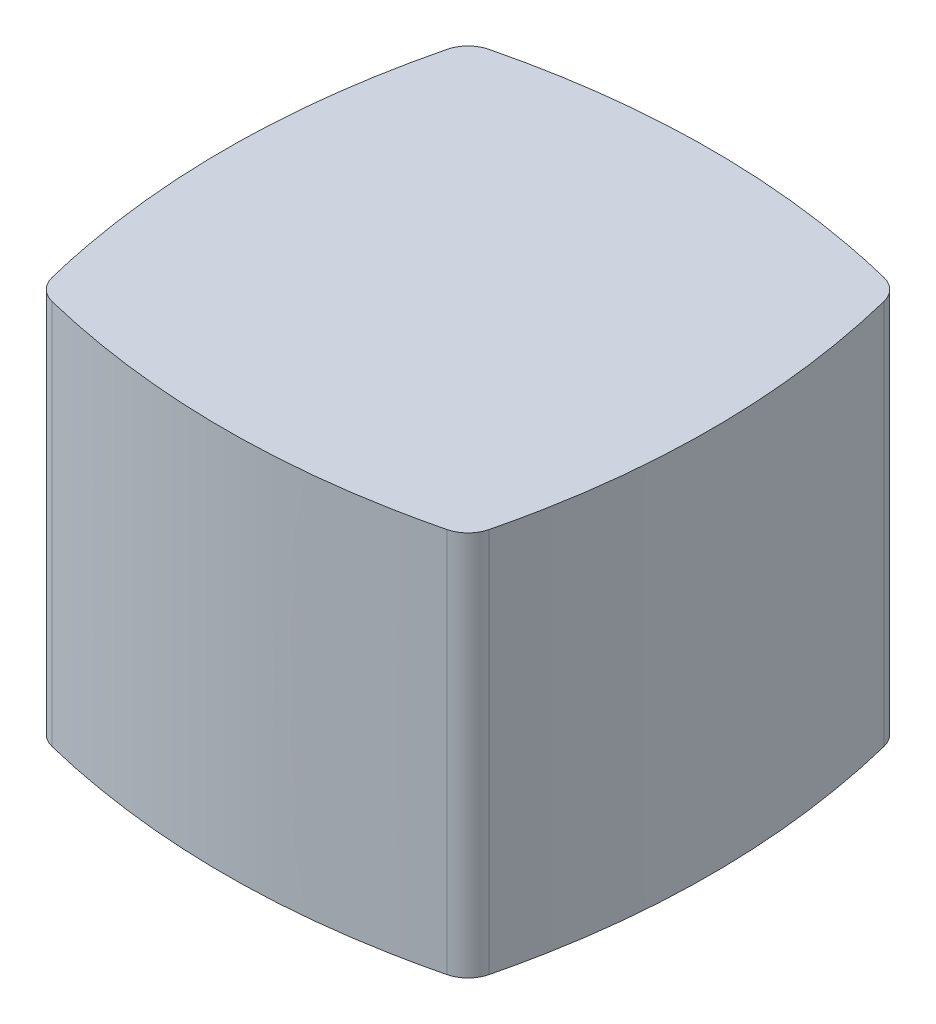
ISO-10303-21;
HEADER;
FILE_DESCRIPTION(('STEP AP214'),'2;1');
FILE_NAME('part.step','',(''),(''),'','','');
FILE_SCHEMA(('AUTOMOTIVE_DESIGN { 1 0 10303 214 1 1 1 1 }'));
ENDSEC;
DATA;
#1=APPLICATION_CONTEXT('core data for automotive mechanical design processes');
#2=APPLICATION_PROTOCOL_DEFINITION('international standard','automotive_design',2000,#1);
#3=PRODUCT_CONTEXT('',#1,'mechanical');
#4=PRODUCT('Part','Part','',(#3));
#5=PRODUCT_RELATED_PRODUCT_CATEGORY('part','',(#4));
#6=PRODUCT_DEFINITION_FORMATION('','',#4);
#7=PRODUCT_DEFINITION_CONTEXT('part definition',#1,'design');
#8=PRODUCT_DEFINITION('design','',#6,#7);
#9=PRODUCT_DEFINITION_SHAPE('','',#8);
#10=(LENGTH_UNIT() NAMED_UNIT(*) SI_UNIT(.MILLI.,.METRE.));
#11=(NAMED_UNIT(*) PLANE_ANGLE_UNIT() SI_UNIT($,.RADIAN.));
#12=(NAMED_UNIT(*) SI_UNIT($,.STERADIAN.) SOLID_ANGLE_UNIT());
#13=UNCERTAINTY_MEASURE_WITH_UNIT(LENGTH_MEASURE(1.E-05),#10,'distance_accuracy_value','');
#14=(GEOMETRIC_REPRESENTATION_CONTEXT(3) GLOBAL_UNCERTAINTY_ASSIGNED_CONTEXT((#13)) GLOBAL_UNIT_ASSIGNED_CONTEXT((#10,
#11,#12)) REPRESENTATION_CONTEXT('',''));
#15=CARTESIAN_POINT('',(0.,0.,0.));
#16=DIRECTION('',(0.,0.,1.));
#17=DIRECTION('',(1.,0.,0.));
#18=AXIS2_PLACEMENT_3D('',#15,#16,#17);
#19=CARTESIAN_POINT('',(0.,0.,0.));
#20=DIRECTION('',(0.,1.,0.));
#21=DIRECTION('',(0.,0.,1.));
#22=AXIS2_PLACEMENT_3D('',#19,#20,#21);
#23=PLANE('',#22);
#24=CARTESIAN_POINT('',(-23.8125,0.,-23.8125));
#25=CARTESIAN_POINT('',(-30.1625,0.,0.));
#26=CARTESIAN_POINT('',(-23.8125,0.,23.8125));
#27=B_SPLINE_CURVE_WITH_KNOTS('',2,(#24,#25,#26),.UNSPECIFIED.,.F.,.F.,(3,3),(0.,1.),.UNSPECIFIED.);
#28=CARTESIAN_POINT('',(-24.2868040136126,0.,-21.9619540073024));
#29=VERTEX_POINT('',#28);
#30=CARTESIAN_POINT('',(-24.2868040136126,0.,21.9619540073025));
#31=VERTEX_POINT('',#30);
#32=EDGE_CURVE('E334',#29,#31,#27,.T.);
#33=ORIENTED_EDGE('',*,*,#32,.F.);
#34=CARTESIAN_POINT('',(-21.2036810612631,0.,-21.2036810612631));
#35=DIRECTION('',(0.,1.,0.));
#36=DIRECTION('',(0.,0.,1.));
#37=AXIS2_PLACEMENT_3D('',#34,#35,#36);
#38=CIRCLE('',#37,3.175);
#39=CARTESIAN_POINT('',(-21.9619540073024,0.,-24.2868040136126));
#40=VERTEX_POINT('',#39);
#41=EDGE_CURVE('E363',#29,#40,#38,.F.);
#42=ORIENTED_EDGE('',*,*,#41,.T.);
#43=CARTESIAN_POINT('',(-23.8125,0.,-23.8125));
#44=CARTESIAN_POINT('',(0.,0.,-30.1625));
#45=CARTESIAN_POINT('',(23.8125,0.,-23.8125));
#46=B_SPLINE_CURVE_WITH_KNOTS('',2,(#43,#44,#45),.UNSPECIFIED.,.F.,.F.,(3,3),(0.,1.),.UNSPECIFIED.);
#47=CARTESIAN_POINT('',(21.9619540073025,0.,-24.2868040136126));
#48=VERTEX_POINT('',#47);
#49=EDGE_CURVE('E326',#40,#48,#46,.T.);
#50=ORIENTED_EDGE('',*,*,#49,.T.);
#51=CARTESIAN_POINT('',(21.2036810612631,0.,-21.2036810612631));
#52=DIRECTION('',(0.,1.,0.));
#53=DIRECTION('',(0.,0.,1.));
#54=AXIS2_PLACEMENT_3D('',#51,#52,#53);
#55=CIRCLE('',#54,3.175);
#56=CARTESIAN_POINT('',(24.2868040136126,0.,-21.9619540073024));
#57=VERTEX_POINT('',#56);
#58=EDGE_CURVE('E361',#48,#57,#55,.F.);
#59=ORIENTED_EDGE('',*,*,#58,.T.);
#60=CARTESIAN_POINT('',(23.8125,0.,-23.8125));
#61=CARTESIAN_POINT('',(30.1625,0.,0.));
#62=CARTESIAN_POINT('',(23.8125,0.,23.8125));
#63=B_SPLINE_CURVE_WITH_KNOTS('',2,(#60,#61,#62),.UNSPECIFIED.,.F.,.F.,(3,3),(0.,1.),.UNSPECIFIED.);
#64=CARTESIAN_POINT('',(24.2868040136126,0.,21.9619540073024));
#65=VERTEX_POINT('',#64);
#66=EDGE_CURVE('E197',#57,#65,#63,.T.);
#67=ORIENTED_EDGE('',*,*,#66,.T.);
#68=CARTESIAN_POINT('',(21.2036810612631,0.,21.2036810612631));
#69=DIRECTION('',(0.,1.,0.));
#70=DIRECTION('',(0.,0.,1.));
#71=AXIS2_PLACEMENT_3D('',#68,#69,#70);
#72=CIRCLE('',#71,3.175);
#73=CARTESIAN_POINT('',(21.9619540073024,0.,24.2868040136126));
#74=VERTEX_POINT('',#73);
#75=EDGE_CURVE('E357',#65,#74,#72,.F.);
#76=ORIENTED_EDGE('',*,*,#75,.T.);
#77=CARTESIAN_POINT('',(-23.8125,0.,23.8125));
#78=CARTESIAN_POINT('',(0.,0.,30.1625));
#79=CARTESIAN_POINT('',(23.8125,0.,23.8125));
#80=B_SPLINE_CURVE_WITH_KNOTS('',2,(#77,#78,#79),.UNSPECIFIED.,.F.,.F.,(3,3),(0.,1.),.UNSPECIFIED.);
#81=CARTESIAN_POINT('',(-21.9619540073024,0.,24.2868040136126));
#82=VERTEX_POINT('',#81);
#83=EDGE_CURVE('E342',#82,#74,#80,.T.);
#84=ORIENTED_EDGE('',*,*,#83,.F.);
#85=CARTESIAN_POINT('',(-21.2036810612631,0.,21.2036810612631));
#86=DIRECTION('',(0.,1.,0.));
#87=DIRECTION('',(0.,0.,1.));
#88=AXIS2_PLACEMENT_3D('',#85,#86,#87);
#89=CIRCLE('',#88,3.175);
#90=EDGE_CURVE('E359',#82,#31,#89,.F.);
#91=ORIENTED_EDGE('',*,*,#90,.T.);
#92=EDGE_LOOP('',(#33,#42,#50,#59,#67,#76,#84,#91));
#93=FACE_BOUND('',#92,.T.);
#94=CARTESIAN_POINT('',(-21.2036810612631,0.,-21.2036810612631));
#95=DIRECTION('',(0.,1.,0.));
#96=DIRECTION('',(0.,0.,1.));
#97=AXIS2_PLACEMENT_3D('',#94,#95,#96);
#98=CIRCLE('',#97,0.635);
#99=CARTESIAN_POINT('',(-21.820305651733,0.,-21.3553356504709));
#100=VERTEX_POINT('',#99);
#101=CARTESIAN_POINT('',(-21.3553356504708,0.,-21.820305651733));
#102=VERTEX_POINT('',#101);
#103=EDGE_CURVE('E188',#100,#102,#98,.F.);
#104=ORIENTED_EDGE('',*,*,#103,.F.);
#105=CARTESIAN_POINT('',(-21.820305651733,0.,-21.3553356504709));
#106=CARTESIAN_POINT('',(-21.9889937306754,0.,-20.6694737113603));
#107=CARTESIAN_POINT('',(-22.1500235066238,0.,-19.9817220928799));
#108=CARTESIAN_POINT('',(-22.456461114876,0.,-18.6027041737678));
#109=CARTESIAN_POINT('',(-22.601867992438,0.,-17.9114376610356));
#110=CARTESIAN_POINT('',(-22.8767359303733,0.,-16.5257276620229));
#111=CARTESIAN_POINT('',(-23.006196741606,0.,-15.8312841262805));
#112=CARTESIAN_POINT('',(-23.2488705156842,0.,-14.4396617999715));
#113=CARTESIAN_POINT('',(-23.3620857172163,0.,-13.7424833999051));
#114=CARTESIAN_POINT('',(-23.5720328451578,0.,-12.3456569201668));
#115=CARTESIAN_POINT('',(-23.6687650368139,0.,-11.6460088804216));
#116=CARTESIAN_POINT('',(-23.8455257692146,0.,-10.2446151461379));
#117=CARTESIAN_POINT('',(-23.9255543645245,0.,-9.54286945845949));
#118=CARTESIAN_POINT('',(-24.1045482393076,0.,-7.78596326287623));
#119=CARTESIAN_POINT('',(-24.1929441074628,0.,-6.72970632794476));
#120=CARTESIAN_POINT('',(-24.3312168757869,0.,-4.61469115724582));
#121=CARTESIAN_POINT('',(-24.3810938939382,0.,-3.55593292914972));
#122=CARTESIAN_POINT('',(-24.4420640778126,0.,-1.43719339677564));
#123=CARTESIAN_POINT('',(-24.4531535174817,0.,-0.377211984778237));
#124=CARTESIAN_POINT('',(-24.4364752606939,0.,1.74248211430688));
#125=CARTESIAN_POINT('',(-24.4087062893066,0.,2.80219479143653));
#126=CARTESIAN_POINT('',(-24.3178750791838,0.,4.84323455009302));
#127=CARTESIAN_POINT('',(-24.2575131212389,0.,5.82468296286204));
#128=CARTESIAN_POINT('',(-24.1037610083231,0.,7.78508809390278));
#129=CARTESIAN_POINT('',(-24.010367562777,0.,8.76404455413815));
#130=CARTESIAN_POINT('',(-23.7909731987534,0.,10.7183737832632));
#131=CARTESIAN_POINT('',(-23.664969570247,0.,11.6937462474737));
#132=CARTESIAN_POINT('',(-23.3807932293291,0.,13.6407203759649));
#133=CARTESIAN_POINT('',(-23.2225905650193,0.,14.6123176646625));
#134=CARTESIAN_POINT('',(-22.8747878301993,0.,16.5497915572413));
#135=CARTESIAN_POINT('',(-22.6851901183949,0.,17.5156685852428));
#136=CARTESIAN_POINT('',(-22.2754519085035,0.,19.4407019994944));
#137=CARTESIAN_POINT('',(-22.0553181895215,0.,20.3998598279187));
#138=CARTESIAN_POINT('',(-21.820305651733,0.,21.3553356504708));
#139=B_SPLINE_CURVE_WITH_KNOTS('',3,(#105,#106,#107,#108,#109,#110,#111,#112,#113,#114,#115,
#116,#117,#118,#119,#120,#121,#122,#123,#124,#125,#126,#127,#128,#129,#130,#131,#132,#133,#134,
#135,#136,#137,#138),.UNSPECIFIED.,.F.,.F.,(4,2,2,2,2,2,2,2,2,2,2,2,2,2,2,2,4),(0.,
2.11887020289457,4.23786981997879,6.35690254001429,8.4756429709258,10.5943493036036,
12.7130487150556,15.892158519184,19.071258585723,22.2506640379961,25.4301738078588,
28.3795283206049,31.3291767289206,34.2790703428894,37.2317206257128,40.1841491768813,
43.1359233240348),.UNSPECIFIED.);
#140=CARTESIAN_POINT('',(-21.820305651733,0.,21.3553356504708));
#141=VERTEX_POINT('',#140);
#142=EDGE_CURVE('E229',#100,#141,#139,.T.);
#143=ORIENTED_EDGE('',*,*,#142,.T.);
#144=CARTESIAN_POINT('',(-21.2036810612631,0.,21.2036810612631));
#145=DIRECTION('',(0.,1.,0.));
#146=DIRECTION('',(0.,0.,1.));
#147=AXIS2_PLACEMENT_3D('',#144,#145,#146);
#148=CIRCLE('',#147,0.635);
#149=CARTESIAN_POINT('',(-21.3553356504709,0.,21.820305651733));
#150=VERTEX_POINT('',#149);
#151=EDGE_CURVE('E237',#150,#141,#148,.F.);
#152=ORIENTED_EDGE('',*,*,#151,.F.);
#153=CARTESIAN_POINT('',(-21.3553356504709,0.,21.820305651733));
#154=CARTESIAN_POINT('',(-20.6694737113603,0.,21.9889937306754));
#155=CARTESIAN_POINT('',(-19.9817220928799,0.,22.1500235066238));
#156=CARTESIAN_POINT('',(-18.6027041737678,0.,22.456461114876));
#157=CARTESIAN_POINT('',(-17.9114376610356,0.,22.601867992438));
#158=CARTESIAN_POINT('',(-16.5257276620229,0.,22.8767359303733));
#159=CARTESIAN_POINT('',(-15.8312841262805,0.,23.006196741606));
#160=CARTESIAN_POINT('',(-14.4396617999715,0.,23.2488705156843));
#161=CARTESIAN_POINT('',(-13.7424833999051,0.,23.3620857172163));
#162=CARTESIAN_POINT('',(-12.3456569201668,0.,23.5720328451578));
#163=CARTESIAN_POINT('',(-11.6460088804216,0.,23.6687650368139));
#164=CARTESIAN_POINT('',(-10.2446151461379,0.,23.8455257692146));
#165=CARTESIAN_POINT('',(-9.54286945845948,0.,23.9255543645245));
#166=CARTESIAN_POINT('',(-7.78596326287622,0.,24.1045482393076));
#167=CARTESIAN_POINT('',(-6.72970632794476,0.,24.1929441074628));
#168=CARTESIAN_POINT('',(-4.61469115724582,0.,24.3312168757868));
#169=CARTESIAN_POINT('',(-3.55593292914971,0.,24.3810938939382));
#170=CARTESIAN_POINT('',(-1.43719339677563,0.,24.4420640778126));
#171=CARTESIAN_POINT('',(-0.377211984778233,0.,24.4531535174817));
#172=CARTESIAN_POINT('',(1.74248211430688,0.,24.4364752606939));
#173=CARTESIAN_POINT('',(2.80219479143653,0.,24.4087062893066));
#174=CARTESIAN_POINT('',(4.84323455009302,0.,24.3178750791838));
#175=CARTESIAN_POINT('',(5.82468296286205,0.,24.2575131212389));
#176=CARTESIAN_POINT('',(7.78508809390278,0.,24.1037610083231));
#177=CARTESIAN_POINT('',(8.76404455413815,0.,24.010367562777));
#178=CARTESIAN_POINT('',(10.7183737832632,0.,23.7909731987534));
#179=CARTESIAN_POINT('',(11.6937462474737,0.,23.664969570247));
#180=CARTESIAN_POINT('',(13.6407203759649,0.,23.3807932293291));
#181=CARTESIAN_POINT('',(14.6123176646625,0.,23.2225905650193));
#182=CARTESIAN_POINT('',(16.5497915572413,0.,22.8747878301993));
#183=CARTESIAN_POINT('',(17.5156685852428,0.,22.6851901183949));
#184=CARTESIAN_POINT('',(19.4407019994944,0.,22.2754519085035));
#185=CARTESIAN_POINT('',(20.3998598279187,0.,22.0553181895215));
#186=CARTESIAN_POINT('',(21.3553356504708,0.,21.820305651733));
#187=B_SPLINE_CURVE_WITH_KNOTS('',3,(#153,#154,#155,#156,#157,#158,#159,#160,#161,#162,#163,
#164,#165,#166,#167,#168,#169,#170,#171,#172,#173,#174,#175,#176,#177,#178,#179,#180,#181,#182,
#183,#184,#185,#186),.UNSPECIFIED.,.F.,.F.,(4,2,2,2,2,2,2,2,2,2,2,2,2,2,2,2,4),(0.,
2.11887020289456,4.23786981997879,6.35690254001429,8.4756429709258,10.5943493036036,
12.7130487150556,15.892158519184,19.071258585723,22.2506640379961,25.4301738078588,
28.3795283206049,31.3291767289206,34.2790703428894,37.2317206257127,40.1841491768812,
43.1359233240348),.UNSPECIFIED.);
#188=CARTESIAN_POINT('',(21.3553356504708,0.,21.820305651733));
#189=VERTEX_POINT('',#188);
#190=EDGE_CURVE('E49',#150,#189,#187,.T.);
#191=ORIENTED_EDGE('',*,*,#190,.T.);
#192=CARTESIAN_POINT('',(21.2036810612631,0.,21.2036810612631));
#193=DIRECTION('',(0.,1.,0.));
#194=DIRECTION('',(0.,0.,1.));
#195=AXIS2_PLACEMENT_3D('',#192,#193,#194);
#196=CIRCLE('',#195,0.635);
#197=CARTESIAN_POINT('',(21.820305651733,0.,21.3553356504709));
#198=VERTEX_POINT('',#197);
#199=EDGE_CURVE('E191',#198,#189,#196,.F.);
#200=ORIENTED_EDGE('',*,*,#199,.F.);
#201=CARTESIAN_POINT('',(21.820305651733,0.,-21.3553356504708));
#202=CARTESIAN_POINT('',(21.9889937306754,0.,-20.6694737113602));
#203=CARTESIAN_POINT('',(22.1500235066238,0.,-19.9817220928798));
#204=CARTESIAN_POINT('',(22.456461114876,0.,-18.6027041737677));
#205=CARTESIAN_POINT('',(22.601867992438,0.,-17.9114376610355));
#206=CARTESIAN_POINT('',(22.8767359303734,0.,-16.5257276620228));
#207=CARTESIAN_POINT('',(23.0061967416061,0.,-15.8312841262804));
#208=CARTESIAN_POINT('',(23.2488705156843,0.,-14.4396617999713));
#209=CARTESIAN_POINT('',(23.3620857172163,0.,-13.742483399905));
#210=CARTESIAN_POINT('',(23.5720328451579,0.,-12.3456569201667));
#211=CARTESIAN_POINT('',(23.6687650368139,0.,-11.6460088804214));
#212=CARTESIAN_POINT('',(23.8455257692146,0.,-10.2446151461378));
#213=CARTESIAN_POINT('',(23.9255543645245,0.,-9.54286945845936));
#214=CARTESIAN_POINT('',(24.1045482393076,0.,-7.78596326287611));
#215=CARTESIAN_POINT('',(24.1929441074628,0.,-6.72970632794464));
#216=CARTESIAN_POINT('',(24.3312168757869,0.,-4.61469115724569));
#217=CARTESIAN_POINT('',(24.3810938939382,0.,-3.55593292914959));
#218=CARTESIAN_POINT('',(24.4420640778126,0.,-1.43719339677551));
#219=CARTESIAN_POINT('',(24.4531535174817,0.,-0.377211984778113));
#220=CARTESIAN_POINT('',(24.4364752606939,0.,1.742482114307));
#221=CARTESIAN_POINT('',(24.4087062893066,0.,2.80219479143666));
#222=CARTESIAN_POINT('',(24.3178750791838,0.,4.84323455009314));
#223=CARTESIAN_POINT('',(24.2575131212389,0.,5.82468296286217));
#224=CARTESIAN_POINT('',(24.1037610083231,0.,7.7850880939029));
#225=CARTESIAN_POINT('',(24.0103675627769,0.,8.76404455413827));
#226=CARTESIAN_POINT('',(23.7909731987534,0.,10.7183737832633));
#227=CARTESIAN_POINT('',(23.664969570247,0.,11.6937462474738));
#228=CARTESIAN_POINT('',(23.3807932293291,0.,13.640720375965));
#229=CARTESIAN_POINT('',(23.2225905650193,0.,14.6123176646626));
#230=CARTESIAN_POINT('',(22.8747878301993,0.,16.5497915572414));
#231=CARTESIAN_POINT('',(22.6851901183949,0.,17.5156685852429));
#232=CARTESIAN_POINT('',(22.2754519085035,0.,19.4407019994945));
#233=CARTESIAN_POINT('',(22.0553181895215,0.,20.3998598279188));
#234=CARTESIAN_POINT('',(21.820305651733,0.,21.3553356504709));
#235=B_SPLINE_CURVE_WITH_KNOTS('',3,(#201,#202,#203,#204,#205,#206,#207,#208,#209,#210,#211,
#212,#213,#214,#215,#216,#217,#218,#219,#220,#221,#222,#223,#224,#225,#226,#227,#228,#229,#230,
#231,#232,#233,#234),.UNSPECIFIED.,.F.,.F.,(4,2,2,2,2,2,2,2,2,2,2,2,2,2,2,2,4),(0.,
2.11887020289456,4.23786981997879,6.35690254001428,8.4756429709258,10.5943493036036,
12.7130487150556,15.892158519184,19.071258585723,22.2506640379961,25.4301738078588,
28.3795283206049,31.3291767289206,34.2790703428894,37.2317206257127,40.1841491768812,
43.1359233240348),.UNSPECIFIED.);
#236=CARTESIAN_POINT('',(21.820305651733,0.,-21.3553356504708));
#237=VERTEX_POINT('',#236);
#238=EDGE_CURVE('E199',#237,#198,#235,.T.);
#239=ORIENTED_EDGE('',*,*,#238,.F.);
#240=CARTESIAN_POINT('',(21.2036810612631,0.,-21.2036810612631));
#241=DIRECTION('',(0.,1.,0.));
#242=DIRECTION('',(0.,0.,1.));
#243=AXIS2_PLACEMENT_3D('',#240,#241,#242);
#244=CIRCLE('',#243,0.635);
#245=CARTESIAN_POINT('',(21.355335650471,0.,-21.820305651733));
#246=VERTEX_POINT('',#245);
#247=EDGE_CURVE('E156',#246,#237,#244,.F.);
#248=ORIENTED_EDGE('',*,*,#247,.F.);
#249=CARTESIAN_POINT('',(-21.3553356504708,0.,-21.820305651733));
#250=CARTESIAN_POINT('',(-20.6694737113602,0.,-21.9889937306754));
#251=CARTESIAN_POINT('',(-19.9817220928798,0.,-22.1500235066238));
#252=CARTESIAN_POINT('',(-18.6027041737677,0.,-22.456461114876));
#253=CARTESIAN_POINT('',(-17.9114376610355,0.,-22.601867992438));
#254=CARTESIAN_POINT('',(-16.5257276620228,0.,-22.8767359303734));
#255=CARTESIAN_POINT('',(-15.8312841262804,0.,-23.006196741606));
#256=CARTESIAN_POINT('',(-14.4396617999713,0.,-23.2488705156843));
#257=CARTESIAN_POINT('',(-13.742483399905,0.,-23.3620857172163));
#258=CARTESIAN_POINT('',(-12.3456569201667,0.,-23.5720328451579));
#259=CARTESIAN_POINT('',(-11.6460088804214,0.,-23.6687650368139));
#260=CARTESIAN_POINT('',(-10.2446151461378,0.,-23.8455257692146));
#261=CARTESIAN_POINT('',(-9.54286945845936,0.,-23.9255543645245));
#262=CARTESIAN_POINT('',(-7.7859632628761,0.,-24.1045482393076));
#263=CARTESIAN_POINT('',(-6.72970632794464,0.,-24.1929441074628));
#264=CARTESIAN_POINT('',(-4.61469115724569,0.,-24.3312168757869));
#265=CARTESIAN_POINT('',(-3.55593292914959,0.,-24.3810938939382));
#266=CARTESIAN_POINT('',(-1.43719339677551,0.,-24.4420640778126));
#267=CARTESIAN_POINT('',(-0.37721198477811,0.,-24.4531535174817));
#268=CARTESIAN_POINT('',(1.74248211430701,0.,-24.4364752606939));
#269=CARTESIAN_POINT('',(2.80219479143666,0.,-24.4087062893066));
#270=CARTESIAN_POINT('',(4.84323455009314,0.,-24.3178750791838));
#271=CARTESIAN_POINT('',(5.82468296286217,0.,-24.2575131212389));
#272=CARTESIAN_POINT('',(7.7850880939029,0.,-24.1037610083231));
#273=CARTESIAN_POINT('',(8.76404455413827,0.,-24.0103675627769));
#274=CARTESIAN_POINT('',(10.7183737832633,0.,-23.7909731987534));
#275=CARTESIAN_POINT('',(11.6937462474738,0.,-23.664969570247));
#276=CARTESIAN_POINT('',(13.640720375965,0.,-23.3807932293291));
#277=CARTESIAN_POINT('',(14.6123176646626,0.,-23.2225905650193));
#278=CARTESIAN_POINT('',(16.5497915572414,0.,-22.8747878301993));
#279=CARTESIAN_POINT('',(17.5156685852429,0.,-22.6851901183949));
#280=CARTESIAN_POINT('',(19.4407019994945,0.,-22.2754519085035));
#281=CARTESIAN_POINT('',(20.3998598279188,0.,-22.0553181895215));
#282=CARTESIAN_POINT('',(21.355335650471,0.,-21.820305651733));
#283=B_SPLINE_CURVE_WITH_KNOTS('',3,(#249,#250,#251,#252,#253,#254,#255,#256,#257,#258,#259,
#260,#261,#262,#263,#264,#265,#266,#267,#268,#269,#270,#271,#272,#273,#274,#275,#276,#277,#278,
#279,#280,#281,#282),.UNSPECIFIED.,.F.,.F.,(4,2,2,2,2,2,2,2,2,2,2,2,2,2,2,2,4),(0.,
2.11887020289456,4.23786981997879,6.35690254001429,8.4756429709258,10.5943493036036,
12.7130487150556,15.892158519184,19.071258585723,22.2506640379961,25.4301738078588,
28.3795283206049,31.3291767289206,34.2790703428894,37.2317206257127,40.1841491768812,
43.1359233240348),.UNSPECIFIED.);
#284=EDGE_CURVE('E207',#102,#246,#283,.T.);
#285=ORIENTED_EDGE('',*,*,#284,.F.);
#286=EDGE_LOOP('',(#104,#143,#152,#191,#200,#239,#248,#285));
#287=FACE_BOUND('',#286,.T.);
#288=ADVANCED_FACE('F34',(#93,#287),#23,.F.);
#289=CARTESIAN_POINT('',(23.8125,42.8625,-23.8125));
#290=CARTESIAN_POINT('',(30.1625,42.8625,0.));
#291=CARTESIAN_POINT('',(23.8125,42.8625,23.8125));
#292=B_SPLINE_CURVE_WITH_KNOTS('',2,(#289,#290,#291),.UNSPECIFIED.,.F.,.F.,(3,3),(0.,1.),.UNSPECIFIED.);
#293=DIRECTION('',(0.,-1.,0.));
#294=VECTOR('',#293,1.);
#295=SURFACE_OF_LINEAR_EXTRUSION('',#292,#294);
#296=ORIENTED_EDGE('',*,*,#66,.F.);
#297=DIRECTION('',(0.,-1.,0.));
#298=VECTOR('',#297,1.);
#299=CARTESIAN_POINT('',(24.2868040136126,0.,-21.9619540073024));
#300=LINE('',#299,#298);
#301=CARTESIAN_POINT('',(24.2868040136126,42.8625,-21.9619540073024));
#302=VERTEX_POINT('',#301);
#303=EDGE_CURVE('E381',#57,#302,#300,.F.);
#304=ORIENTED_EDGE('',*,*,#303,.T.);
#305=CARTESIAN_POINT('',(24.2868040136126,42.8625,21.9619540073024));
#306=VERTEX_POINT('',#305);
#307=EDGE_CURVE('E349',#302,#306,#292,.T.);
#308=ORIENTED_EDGE('',*,*,#307,.T.);
#309=DIRECTION('',(0.,-1.,0.));
#310=VECTOR('',#309,1.);
#311=CARTESIAN_POINT('',(24.2868040136126,42.8625,21.9619540073024));
#312=LINE('',#311,#310);
#313=EDGE_CURVE('E378',#306,#65,#312,.T.);
#314=ORIENTED_EDGE('',*,*,#313,.T.);
#315=EDGE_LOOP('',(#296,#304,#308,#314));
#316=FACE_BOUND('',#315,.T.);
#317=ADVANCED_FACE('F387',(#316),#295,.T.);
#318=CARTESIAN_POINT('',(-23.8125,42.8625,-23.8125));
#319=CARTESIAN_POINT('',(0.,42.8625,-30.1625));
#320=CARTESIAN_POINT('',(23.8125,42.8625,-23.8125));
#321=B_SPLINE_CURVE_WITH_KNOTS('',2,(#318,#319,#320),.UNSPECIFIED.,.F.,.F.,(3,3),(0.,1.),.UNSPECIFIED.);
#322=DIRECTION('',(0.,-1.,0.));
#323=VECTOR('',#322,1.);
#324=SURFACE_OF_LINEAR_EXTRUSION('',#321,#323);
#325=ORIENTED_EDGE('',*,*,#49,.F.);
#326=DIRECTION('',(0.,-1.,0.));
#327=VECTOR('',#326,1.);
#328=CARTESIAN_POINT('',(-21.9619540073024,0.,-24.2868040136126));
#329=LINE('',#328,#327);
#330=CARTESIAN_POINT('',(-21.9619540073024,42.8625,-24.2868040136126));
#331=VERTEX_POINT('',#330);
#332=EDGE_CURVE('E368',#40,#331,#329,.F.);
#333=ORIENTED_EDGE('',*,*,#332,.T.);
#334=CARTESIAN_POINT('',(21.9619540073025,42.8625,-24.2868040136126));
#335=VERTEX_POINT('',#334);
#336=EDGE_CURVE('E265',#331,#335,#321,.T.);
#337=ORIENTED_EDGE('',*,*,#336,.T.);
#338=DIRECTION('',(0.,-1.,0.));
#339=VECTOR('',#338,1.);
#340=CARTESIAN_POINT('',(21.9619540073025,42.8625,-24.2868040136126));
#341=LINE('',#340,#339);
#342=EDGE_CURVE('E365',#335,#48,#341,.T.);
#343=ORIENTED_EDGE('',*,*,#342,.T.);
#344=EDGE_LOOP('',(#325,#333,#337,#343));
#345=FACE_BOUND('',#344,.T.);
#346=ADVANCED_FACE('F255',(#345),#324,.T.);
#347=CARTESIAN_POINT('',(-23.8125,42.8625,-23.8125));
#348=CARTESIAN_POINT('',(-30.1625,42.8625,0.));
#349=CARTESIAN_POINT('',(-23.8125,42.8625,23.8125));
#350=B_SPLINE_CURVE_WITH_KNOTS('',2,(#347,#348,#349),.UNSPECIFIED.,.F.,.F.,(3,3),(0.,1.),.UNSPECIFIED.);
#351=DIRECTION('',(0.,-1.,0.));
#352=VECTOR('',#351,1.);
#353=SURFACE_OF_LINEAR_EXTRUSION('',#350,#352);
#354=CARTESIAN_POINT('',(-24.2868040136126,42.8625,-21.9619540073024));
#355=VERTEX_POINT('',#354);
#356=CARTESIAN_POINT('',(-24.2868040136126,42.8625,21.9619540073025));
#357=VERTEX_POINT('',#356);
#358=EDGE_CURVE('E259',#355,#357,#350,.T.);
#359=ORIENTED_EDGE('',*,*,#358,.F.);
#360=DIRECTION('',(0.,-1.,0.));
#361=VECTOR('',#360,1.);
#362=CARTESIAN_POINT('',(-24.2868040136126,42.8625,-21.9619540073024));
#363=LINE('',#362,#361);
#364=EDGE_CURVE('E354',#355,#29,#363,.T.);
#365=ORIENTED_EDGE('',*,*,#364,.T.);
#366=ORIENTED_EDGE('',*,*,#32,.T.);
#367=DIRECTION('',(0.,-1.,0.));
#368=VECTOR('',#367,1.);
#369=CARTESIAN_POINT('',(-24.2868040136126,0.,21.9619540073025));
#370=LINE('',#369,#368);
#371=EDGE_CURVE('E276',#31,#357,#370,.F.);
#372=ORIENTED_EDGE('',*,*,#371,.T.);
#373=EDGE_LOOP('',(#359,#365,#366,#372));
#374=FACE_BOUND('',#373,.T.);
#375=ADVANCED_FACE('F251',(#374),#353,.F.);
#376=CARTESIAN_POINT('',(-23.8125,42.8625,23.8125));
#377=CARTESIAN_POINT('',(0.,42.8625,30.1625));
#378=CARTESIAN_POINT('',(23.8125,42.8625,23.8125));
#379=B_SPLINE_CURVE_WITH_KNOTS('',2,(#376,#377,#378),.UNSPECIFIED.,.F.,.F.,(3,3),(0.,1.),.UNSPECIFIED.);
#380=DIRECTION('',(0.,-1.,0.));
#381=VECTOR('',#380,1.);
#382=SURFACE_OF_LINEAR_EXTRUSION('',#379,#381);
#383=CARTESIAN_POINT('',(-21.9619540073024,42.8625,24.2868040136126));
#384=VERTEX_POINT('',#383);
#385=CARTESIAN_POINT('',(21.9619540073024,42.8625,24.2868040136126));
#386=VERTEX_POINT('',#385);
#387=EDGE_CURVE('E264',#384,#386,#379,.T.);
#388=ORIENTED_EDGE('',*,*,#387,.F.);
#389=DIRECTION('',(0.,-1.,0.));
#390=VECTOR('',#389,1.);
#391=CARTESIAN_POINT('',(-21.9619540073024,42.8625,24.2868040136126));
#392=LINE('',#391,#390);
#393=EDGE_CURVE('E11',#384,#82,#392,.T.);
#394=ORIENTED_EDGE('',*,*,#393,.T.);
#395=ORIENTED_EDGE('',*,*,#83,.T.);
#396=DIRECTION('',(0.,-1.,0.));
#397=VECTOR('',#396,1.);
#398=CARTESIAN_POINT('',(21.9619540073024,0.,24.2868040136126));
#399=LINE('',#398,#397);
#400=EDGE_CURVE('E42',#74,#386,#399,.F.);
#401=ORIENTED_EDGE('',*,*,#400,.T.);
#402=EDGE_LOOP('',(#388,#394,#395,#401));
#403=FACE_BOUND('',#402,.T.);
#404=ADVANCED_FACE('F214',(#403),#382,.F.);
#405=CARTESIAN_POINT('',(0.,42.8625,0.));
#406=DIRECTION('',(0.,1.,0.));
#407=DIRECTION('',(0.,0.,1.));
#408=AXIS2_PLACEMENT_3D('',#405,#406,#407);
#409=PLANE('',#408);
#410=ORIENTED_EDGE('',*,*,#336,.F.);
#411=CARTESIAN_POINT('',(-21.2036810612631,42.8625,-21.2036810612631));
#412=DIRECTION('',(0.,1.,0.));
#413=DIRECTION('',(0.,0.,1.));
#414=AXIS2_PLACEMENT_3D('',#411,#412,#413);
#415=CIRCLE('',#414,3.175);
#416=EDGE_CURVE('E376',#331,#355,#415,.T.);
#417=ORIENTED_EDGE('',*,*,#416,.T.);
#418=ORIENTED_EDGE('',*,*,#358,.T.);
#419=CARTESIAN_POINT('',(-21.2036810612631,42.8625,21.2036810612631));
#420=DIRECTION('',(0.,1.,0.));
#421=DIRECTION('',(0.,0.,1.));
#422=AXIS2_PLACEMENT_3D('',#419,#420,#421);
#423=CIRCLE('',#422,3.175);
#424=EDGE_CURVE('E372',#357,#384,#423,.T.);
#425=ORIENTED_EDGE('',*,*,#424,.T.);
#426=ORIENTED_EDGE('',*,*,#387,.T.);
#427=CARTESIAN_POINT('',(21.2036810612631,42.8625,21.2036810612631));
#428=DIRECTION('',(0.,1.,0.));
#429=DIRECTION('',(0.,0.,1.));
#430=AXIS2_PLACEMENT_3D('',#427,#428,#429);
#431=CIRCLE('',#430,3.175);
#432=EDGE_CURVE('E370',#386,#306,#431,.T.);
#433=ORIENTED_EDGE('',*,*,#432,.T.);
#434=ORIENTED_EDGE('',*,*,#307,.F.);
#435=CARTESIAN_POINT('',(21.2036810612631,42.8625,-21.2036810612631));
#436=DIRECTION('',(0.,1.,0.));
#437=DIRECTION('',(0.,0.,1.));
#438=AXIS2_PLACEMENT_3D('',#435,#436,#437);
#439=CIRCLE('',#438,3.175);
#440=EDGE_CURVE('E374',#302,#335,#439,.T.);
#441=ORIENTED_EDGE('',*,*,#440,.T.);
#442=EDGE_LOOP('',(#410,#417,#418,#425,#426,#433,#434,#441));
#443=FACE_BOUND('',#442,.T.);
#444=ADVANCED_FACE('F393',(#443),#409,.T.);
#445=CARTESIAN_POINT('',(-21.2036810612631,21.43125,-21.2036810612631));
#446=DIRECTION('',(0.,-1.,0.));
#447=DIRECTION('',(0.,0.,-1.));
#448=AXIS2_PLACEMENT_3D('',#445,#446,#447);
#449=CYLINDRICAL_SURFACE('',#448,3.175);
#450=ORIENTED_EDGE('',*,*,#416,.F.);
#451=ORIENTED_EDGE('',*,*,#332,.F.);
#452=ORIENTED_EDGE('',*,*,#41,.F.);
#453=ORIENTED_EDGE('',*,*,#364,.F.);
#454=EDGE_LOOP('',(#450,#451,#452,#453));
#455=FACE_BOUND('',#454,.T.);
#456=ADVANCED_FACE('F406',(#455),#449,.T.);
#457=CARTESIAN_POINT('',(21.2036810612631,21.43125,-21.2036810612631));
#458=DIRECTION('',(0.,-1.,0.));
#459=DIRECTION('',(0.,0.,-1.));
#460=AXIS2_PLACEMENT_3D('',#457,#458,#459);
#461=CYLINDRICAL_SURFACE('',#460,3.175);
#462=ORIENTED_EDGE('',*,*,#440,.F.);
#463=ORIENTED_EDGE('',*,*,#303,.F.);
#464=ORIENTED_EDGE('',*,*,#58,.F.);
#465=ORIENTED_EDGE('',*,*,#342,.F.);
#466=EDGE_LOOP('',(#462,#463,#464,#465));
#467=FACE_BOUND('',#466,.T.);
#468=ADVANCED_FACE('F397',(#467),#461,.T.);
#469=CARTESIAN_POINT('',(-21.2036810612631,21.43125,21.2036810612631));
#470=DIRECTION('',(0.,-1.,0.));
#471=DIRECTION('',(0.,0.,-1.));
#472=AXIS2_PLACEMENT_3D('',#469,#470,#471);
#473=CYLINDRICAL_SURFACE('',#472,3.175);
#474=ORIENTED_EDGE('',*,*,#424,.F.);
#475=ORIENTED_EDGE('',*,*,#371,.F.);
#476=ORIENTED_EDGE('',*,*,#90,.F.);
#477=ORIENTED_EDGE('',*,*,#393,.F.);
#478=EDGE_LOOP('',(#474,#475,#476,#477));
#479=FACE_BOUND('',#478,.T.);
#480=ADVANCED_FACE('F412',(#479),#473,.T.);
#481=CARTESIAN_POINT('',(21.2036810612631,21.43125,21.2036810612631));
#482=DIRECTION('',(0.,-1.,0.));
#483=DIRECTION('',(0.,0.,-1.));
#484=AXIS2_PLACEMENT_3D('',#481,#482,#483);
#485=CYLINDRICAL_SURFACE('',#484,3.175);
#486=ORIENTED_EDGE('',*,*,#432,.F.);
#487=ORIENTED_EDGE('',*,*,#400,.F.);
#488=ORIENTED_EDGE('',*,*,#75,.F.);
#489=ORIENTED_EDGE('',*,*,#313,.F.);
#490=EDGE_LOOP('',(#486,#487,#488,#489));
#491=FACE_BOUND('',#490,.T.);
#492=ADVANCED_FACE('F36',(#491),#485,.T.);
#493=CARTESIAN_POINT('',(23.8125,42.8625,-23.8125));
#494=CARTESIAN_POINT('',(30.1625,42.8625,0.));
#495=CARTESIAN_POINT('',(23.8125,42.8625,23.8125));
#496=B_SPLINE_CURVE_WITH_KNOTS('',2,(#493,#494,#495),.UNSPECIFIED.,.F.,.F.,(3,3),(0.,1.),.UNSPECIFIED.);
#497=DIRECTION('',(0.,-1.,0.));
#498=VECTOR('',#497,1.);
#499=SURFACE_OF_LINEAR_EXTRUSION('',#496,#498);
#500=OFFSET_SURFACE('',#499,-2.54,.F.);
#501=ORIENTED_EDGE('',*,*,#238,.T.);
#502=DIRECTION('',(0.,-1.,0.));
#503=VECTOR('',#502,1.);
#504=CARTESIAN_POINT('',(21.820305651733,42.8625,21.3553356504708));
#505=LINE('',#504,#503);
#506=CARTESIAN_POINT('',(21.820305651733,17.4625,21.3553356504708));
#507=VERTEX_POINT('',#506);
#508=EDGE_CURVE('E161',#507,#198,#505,.T.);
#509=ORIENTED_EDGE('',*,*,#508,.F.);
#510=CARTESIAN_POINT('',(21.820305651733,17.4625,-21.3553356504708));
#511=CARTESIAN_POINT('',(21.9889937306754,17.4625,-20.6694737113602));
#512=CARTESIAN_POINT('',(22.1500235066238,17.4625,-19.9817220928798));
#513=CARTESIAN_POINT('',(22.456461114876,17.4625,-18.6027041737677));
#514=CARTESIAN_POINT('',(22.601867992438,17.4625,-17.9114376610355));
#515=CARTESIAN_POINT('',(22.8767359303734,17.4625,-16.5257276620228));
#516=CARTESIAN_POINT('',(23.0061967416061,17.4625,-15.8312841262804));
#517=CARTESIAN_POINT('',(23.2488705156843,17.4625,-14.4396617999713));
#518=CARTESIAN_POINT('',(23.3620857172163,17.4625,-13.742483399905));
#519=CARTESIAN_POINT('',(23.5720328451579,17.4625,-12.3456569201667));
#520=CARTESIAN_POINT('',(23.6687650368139,17.4625,-11.6460088804214));
#521=CARTESIAN_POINT('',(23.8455257692146,17.4625,-10.2446151461378));
#522=CARTESIAN_POINT('',(23.9255543645245,17.4625,-9.54286945845936));
#523=CARTESIAN_POINT('',(24.1045482393076,17.4625,-7.78596326287611));
#524=CARTESIAN_POINT('',(24.1929441074628,17.4625,-6.72970632794464));
#525=CARTESIAN_POINT('',(24.3312168757869,17.4625,-4.61469115724569));
#526=CARTESIAN_POINT('',(24.3810938939382,17.4625,-3.55593292914959));
#527=CARTESIAN_POINT('',(24.4420640778126,17.4625,-1.43719339677551));
#528=CARTESIAN_POINT('',(24.4531535174817,17.4625,-0.377211984778113));
#529=CARTESIAN_POINT('',(24.4364752606939,17.4625,1.742482114307));
#530=CARTESIAN_POINT('',(24.4087062893066,17.4625,2.80219479143666));
#531=CARTESIAN_POINT('',(24.3178750791838,17.4625,4.84323455009313));
#532=CARTESIAN_POINT('',(24.2575131212389,17.4625,5.82468296286215));
#533=CARTESIAN_POINT('',(24.1037610083231,17.4625,7.78508809390287));
#534=CARTESIAN_POINT('',(24.0103675627769,17.4625,8.76404455413823));
#535=CARTESIAN_POINT('',(23.7909731987534,17.4625,10.7183737832633));
#536=CARTESIAN_POINT('',(23.664969570247,17.4625,11.6937462474738));
#537=CARTESIAN_POINT('',(23.3807932293291,17.4625,13.6407203759649));
#538=CARTESIAN_POINT('',(23.2225905650193,17.4625,14.6123176646625));
#539=CARTESIAN_POINT('',(22.8747878301993,17.4625,16.5497915572413));
#540=CARTESIAN_POINT('',(22.6851901183949,17.4625,17.5156685852428));
#541=CARTESIAN_POINT('',(22.2754519085035,17.4625,19.4407019994944));
#542=CARTESIAN_POINT('',(22.0553181895216,17.4625,20.3998598279187));
#543=CARTESIAN_POINT('',(21.820305651733,17.4625,21.3553356504708));
#544=B_SPLINE_CURVE_WITH_KNOTS('',3,(#510,#511,#512,#513,#514,#515,#516,#517,#518,#519,#520,
#521,#522,#523,#524,#525,#526,#527,#528,#529,#530,#531,#532,#533,#534,#535,#536,#537,#538,#539,
#540,#541,#542,#543),.UNSPECIFIED.,.F.,.F.,(4,2,2,2,2,2,2,2,2,2,2,2,2,2,2,2,4),(0.,
2.11887020289456,4.23786981997879,6.35690254001428,8.4756429709258,10.5943493036036,
12.7130487150556,15.892158519184,19.071258585723,22.2506640379961,25.4301738078588,
28.3795283206048,31.3291767289205,34.2790703428893,37.2317206257127,40.1841491768811,
43.1359233240347),.UNSPECIFIED.);
#545=CARTESIAN_POINT('',(21.820305651733,17.4625,-21.3553356504708));
#546=VERTEX_POINT('',#545);
#547=EDGE_CURVE('E165',#546,#507,#544,.T.);
#548=ORIENTED_EDGE('',*,*,#547,.F.);
#549=DIRECTION('',(0.,-1.,0.));
#550=VECTOR('',#549,1.);
#551=CARTESIAN_POINT('',(21.820305651733,42.8625,-21.3553356504708));
#552=LINE('',#551,#550);
#553=EDGE_CURVE('E149',#237,#546,#552,.F.);
#554=ORIENTED_EDGE('',*,*,#553,.F.);
#555=EDGE_LOOP('',(#501,#509,#548,#554));
#556=FACE_BOUND('',#555,.T.);
#557=ADVANCED_FACE('F166',(#556),#500,.F.);
#558=CARTESIAN_POINT('',(-23.8125,42.8625,-23.8125));
#559=CARTESIAN_POINT('',(0.,42.8625,-30.1625));
#560=CARTESIAN_POINT('',(23.8125,42.8625,-23.8125));
#561=B_SPLINE_CURVE_WITH_KNOTS('',2,(#558,#559,#560),.UNSPECIFIED.,.F.,.F.,(3,3),(0.,1.),.UNSPECIFIED.);
#562=DIRECTION('',(0.,-1.,0.));
#563=VECTOR('',#562,1.);
#564=SURFACE_OF_LINEAR_EXTRUSION('',#561,#563);
#565=OFFSET_SURFACE('',#564,-2.54,.F.);
#566=ORIENTED_EDGE('',*,*,#284,.T.);
#567=DIRECTION('',(0.,-1.,0.));
#568=VECTOR('',#567,1.);
#569=CARTESIAN_POINT('',(21.3553356504708,42.8625,-21.820305651733));
#570=LINE('',#569,#568);
#571=CARTESIAN_POINT('',(21.3553356504708,17.4625,-21.820305651733));
#572=VERTEX_POINT('',#571);
#573=EDGE_CURVE('E186',#572,#246,#570,.T.);
#574=ORIENTED_EDGE('',*,*,#573,.F.);
#575=CARTESIAN_POINT('',(-21.3553356504708,17.4625,-21.820305651733));
#576=CARTESIAN_POINT('',(-20.6694737113602,17.4625,-21.9889937306754));
#577=CARTESIAN_POINT('',(-19.9817220928798,17.4625,-22.1500235066238));
#578=CARTESIAN_POINT('',(-18.6027041737677,17.4625,-22.456461114876));
#579=CARTESIAN_POINT('',(-17.9114376610355,17.4625,-22.601867992438));
#580=CARTESIAN_POINT('',(-16.5257276620228,17.4625,-22.8767359303734));
#581=CARTESIAN_POINT('',(-15.8312841262804,17.4625,-23.006196741606));
#582=CARTESIAN_POINT('',(-14.4396617999713,17.4625,-23.2488705156843));
#583=CARTESIAN_POINT('',(-13.742483399905,17.4625,-23.3620857172163));
#584=CARTESIAN_POINT('',(-12.3456569201667,17.4625,-23.5720328451579));
#585=CARTESIAN_POINT('',(-11.6460088804214,17.4625,-23.6687650368139));
#586=CARTESIAN_POINT('',(-10.2446151461378,17.4625,-23.8455257692146));
#587=CARTESIAN_POINT('',(-9.54286945845935,17.4625,-23.9255543645245));
#588=CARTESIAN_POINT('',(-7.7859632628761,17.4625,-24.1045482393076));
#589=CARTESIAN_POINT('',(-6.72970632794464,17.4625,-24.1929441074628));
#590=CARTESIAN_POINT('',(-4.61469115724569,17.4625,-24.3312168757869));
#591=CARTESIAN_POINT('',(-3.55593292914959,17.4625,-24.3810938939382));
#592=CARTESIAN_POINT('',(-1.43719339677551,17.4625,-24.4420640778126));
#593=CARTESIAN_POINT('',(-0.37721198477811,17.4625,-24.4531535174817));
#594=CARTESIAN_POINT('',(1.74248211430701,17.4625,-24.4364752606939));
#595=CARTESIAN_POINT('',(2.80219479143666,17.4625,-24.4087062893066));
#596=CARTESIAN_POINT('',(4.84323455009313,17.4625,-24.3178750791838));
#597=CARTESIAN_POINT('',(5.82468296286215,17.4625,-24.2575131212389));
#598=CARTESIAN_POINT('',(7.78508809390287,17.4625,-24.1037610083231));
#599=CARTESIAN_POINT('',(8.76404455413824,17.4625,-24.0103675627769));
#600=CARTESIAN_POINT('',(10.7183737832633,17.4625,-23.7909731987534));
#601=CARTESIAN_POINT('',(11.6937462474738,17.4625,-23.664969570247));
#602=CARTESIAN_POINT('',(13.6407203759649,17.4625,-23.3807932293291));
#603=CARTESIAN_POINT('',(14.6123176646625,17.4625,-23.2225905650193));
#604=CARTESIAN_POINT('',(16.5497915572414,17.4625,-22.8747878301993));
#605=CARTESIAN_POINT('',(17.5156685852428,17.4625,-22.6851901183949));
#606=CARTESIAN_POINT('',(19.4407019994944,17.4625,-22.2754519085035));
#607=CARTESIAN_POINT('',(20.3998598279187,17.4625,-22.0553181895215));
#608=CARTESIAN_POINT('',(21.3553356504708,17.4625,-21.820305651733));
#609=B_SPLINE_CURVE_WITH_KNOTS('',3,(#575,#576,#577,#578,#579,#580,#581,#582,#583,#584,#585,
#586,#587,#588,#589,#590,#591,#592,#593,#594,#595,#596,#597,#598,#599,#600,#601,#602,#603,#604,
#605,#606,#607,#608),.UNSPECIFIED.,.F.,.F.,(4,2,2,2,2,2,2,2,2,2,2,2,2,2,2,2,4),(0.,
2.11887020289456,4.23786981997879,6.35690254001429,8.4756429709258,10.5943493036036,
12.7130487150556,15.892158519184,19.071258585723,22.2506640379961,25.4301738078588,
28.3795283206048,31.3291767289205,34.2790703428893,37.2317206257127,40.1841491768811,
43.1359233240347),.UNSPECIFIED.);
#610=CARTESIAN_POINT('',(-21.3553356504708,17.4625,-21.820305651733));
#611=VERTEX_POINT('',#610);
#612=EDGE_CURVE('E169',#611,#572,#609,.T.);
#613=ORIENTED_EDGE('',*,*,#612,.F.);
#614=DIRECTION('',(0.,-1.,0.));
#615=VECTOR('',#614,1.);
#616=CARTESIAN_POINT('',(-21.3553356504708,42.8625,-21.820305651733));
#617=LINE('',#616,#615);
#618=EDGE_CURVE('E184',#102,#611,#617,.F.);
#619=ORIENTED_EDGE('',*,*,#618,.F.);
#620=EDGE_LOOP('',(#566,#574,#613,#619));
#621=FACE_BOUND('',#620,.T.);
#622=ADVANCED_FACE('F243',(#621),#565,.F.);
#623=CARTESIAN_POINT('',(-23.8125,42.8625,-23.8125));
#624=CARTESIAN_POINT('',(-30.1625,42.8625,0.));
#625=CARTESIAN_POINT('',(-23.8125,42.8625,23.8125));
#626=B_SPLINE_CURVE_WITH_KNOTS('',2,(#623,#624,#625),.UNSPECIFIED.,.F.,.F.,(3,3),(0.,1.),.UNSPECIFIED.);
#627=DIRECTION('',(0.,-1.,0.));
#628=VECTOR('',#627,1.);
#629=SURFACE_OF_LINEAR_EXTRUSION('',#626,#628);
#630=OFFSET_SURFACE('',#629,2.54,.F.);
#631=CARTESIAN_POINT('',(-21.820305651733,17.4625,-21.3553356504708));
#632=CARTESIAN_POINT('',(-21.9889937306754,17.4625,-20.6694737113602));
#633=CARTESIAN_POINT('',(-22.1500235066238,17.4625,-19.9817220928798));
#634=CARTESIAN_POINT('',(-22.456461114876,17.4625,-18.6027041737677));
#635=CARTESIAN_POINT('',(-22.601867992438,17.4625,-17.9114376610355));
#636=CARTESIAN_POINT('',(-22.8767359303734,17.4625,-16.5257276620228));
#637=CARTESIAN_POINT('',(-23.0061967416061,17.4625,-15.8312841262804));
#638=CARTESIAN_POINT('',(-23.2488705156843,17.4625,-14.4396617999713));
#639=CARTESIAN_POINT('',(-23.3620857172163,17.4625,-13.742483399905));
#640=CARTESIAN_POINT('',(-23.5720328451579,17.4625,-12.3456569201667));
#641=CARTESIAN_POINT('',(-23.6687650368139,17.4625,-11.6460088804214));
#642=CARTESIAN_POINT('',(-23.8455257692146,17.4625,-10.2446151461378));
#643=CARTESIAN_POINT('',(-23.9255543645245,17.4625,-9.54286945845936));
#644=CARTESIAN_POINT('',(-24.1045482393076,17.4625,-7.7859632628761));
#645=CARTESIAN_POINT('',(-24.1929441074628,17.4625,-6.72970632794464));
#646=CARTESIAN_POINT('',(-24.3312168757869,17.4625,-4.61469115724569));
#647=CARTESIAN_POINT('',(-24.3810938939382,17.4625,-3.55593292914959));
#648=CARTESIAN_POINT('',(-24.4420640778126,17.4625,-1.43719339677551));
#649=CARTESIAN_POINT('',(-24.4531535174817,17.4625,-0.377211984778108));
#650=CARTESIAN_POINT('',(-24.4364752606939,17.4625,1.74248211430701));
#651=CARTESIAN_POINT('',(-24.4087062893066,17.4625,2.80219479143666));
#652=CARTESIAN_POINT('',(-24.3178750791838,17.4625,4.84323455009314));
#653=CARTESIAN_POINT('',(-24.2575131212389,17.4625,5.82468296286216));
#654=CARTESIAN_POINT('',(-24.1037610083231,17.4625,7.78508809390287));
#655=CARTESIAN_POINT('',(-24.0103675627769,17.4625,8.76404455413824));
#656=CARTESIAN_POINT('',(-23.7909731987534,17.4625,10.7183737832633));
#657=CARTESIAN_POINT('',(-23.664969570247,17.4625,11.6937462474738));
#658=CARTESIAN_POINT('',(-23.3807932293291,17.4625,13.6407203759649));
#659=CARTESIAN_POINT('',(-23.2225905650193,17.4625,14.6123176646625));
#660=CARTESIAN_POINT('',(-22.8747878301993,17.4625,16.5497915572414));
#661=CARTESIAN_POINT('',(-22.6851901183949,17.4625,17.5156685852428));
#662=CARTESIAN_POINT('',(-22.2754519085035,17.4625,19.4407019994944));
#663=CARTESIAN_POINT('',(-22.0553181895215,17.4625,20.3998598279187));
#664=CARTESIAN_POINT('',(-21.820305651733,17.4625,21.3553356504708));
#665=B_SPLINE_CURVE_WITH_KNOTS('',3,(#631,#632,#633,#634,#635,#636,#637,#638,#639,#640,#641,
#642,#643,#644,#645,#646,#647,#648,#649,#650,#651,#652,#653,#654,#655,#656,#657,#658,#659,#660,
#661,#662,#663,#664),.UNSPECIFIED.,.F.,.F.,(4,2,2,2,2,2,2,2,2,2,2,2,2,2,2,2,4),(0.,
2.11887020289456,4.23786981997878,6.35690254001429,8.4756429709258,10.5943493036036,
12.7130487150556,15.892158519184,19.071258585723,22.2506640379961,25.4301738078588,
28.3795283206049,31.3291767289206,34.2790703428893,37.2317206257127,40.1841491768812,
43.1359233240347),.UNSPECIFIED.);
#666=CARTESIAN_POINT('',(-21.820305651733,17.4625,-21.3553356504708));
#667=VERTEX_POINT('',#666);
#668=CARTESIAN_POINT('',(-21.820305651733,17.4625,21.3553356504708));
#669=VERTEX_POINT('',#668);
#670=EDGE_CURVE('E296',#667,#669,#665,.T.);
#671=ORIENTED_EDGE('',*,*,#670,.T.);
#672=DIRECTION('',(0.,-1.,0.));
#673=VECTOR('',#672,1.);
#674=CARTESIAN_POINT('',(-21.820305651733,42.8625,21.3553356504708));
#675=LINE('',#674,#673);
#676=EDGE_CURVE('E192',#141,#669,#675,.F.);
#677=ORIENTED_EDGE('',*,*,#676,.F.);
#678=ORIENTED_EDGE('',*,*,#142,.F.);
#679=DIRECTION('',(0.,-1.,0.));
#680=VECTOR('',#679,1.);
#681=CARTESIAN_POINT('',(-21.820305651733,42.8625,-21.3553356504708));
#682=LINE('',#681,#680);
#683=EDGE_CURVE('E189',#667,#100,#682,.T.);
#684=ORIENTED_EDGE('',*,*,#683,.F.);
#685=EDGE_LOOP('',(#671,#677,#678,#684));
#686=FACE_BOUND('',#685,.T.);
#687=ADVANCED_FACE('F238',(#686),#630,.T.);
#688=CARTESIAN_POINT('',(-23.8125,42.8625,23.8125));
#689=CARTESIAN_POINT('',(0.,42.8625,30.1625));
#690=CARTESIAN_POINT('',(23.8125,42.8625,23.8125));
#691=B_SPLINE_CURVE_WITH_KNOTS('',2,(#688,#689,#690),.UNSPECIFIED.,.F.,.F.,(3,3),(0.,1.),.UNSPECIFIED.);
#692=DIRECTION('',(0.,-1.,0.));
#693=VECTOR('',#692,1.);
#694=SURFACE_OF_LINEAR_EXTRUSION('',#691,#693);
#695=OFFSET_SURFACE('',#694,2.54,.F.);
#696=CARTESIAN_POINT('',(-21.3553356504708,17.4625,21.820305651733));
#697=CARTESIAN_POINT('',(-20.6694737113602,17.4625,21.9889937306754));
#698=CARTESIAN_POINT('',(-19.9817220928798,17.4625,22.1500235066238));
#699=CARTESIAN_POINT('',(-18.6027041737677,17.4625,22.456461114876));
#700=CARTESIAN_POINT('',(-17.9114376610355,17.4625,22.601867992438));
#701=CARTESIAN_POINT('',(-16.5257276620228,17.4625,22.8767359303734));
#702=CARTESIAN_POINT('',(-15.8312841262804,17.4625,23.006196741606));
#703=CARTESIAN_POINT('',(-14.4396617999713,17.4625,23.2488705156843));
#704=CARTESIAN_POINT('',(-13.742483399905,17.4625,23.3620857172163));
#705=CARTESIAN_POINT('',(-12.3456569201667,17.4625,23.5720328451579));
#706=CARTESIAN_POINT('',(-11.6460088804214,17.4625,23.6687650368139));
#707=CARTESIAN_POINT('',(-10.2446151461378,17.4625,23.8455257692146));
#708=CARTESIAN_POINT('',(-9.54286945845936,17.4625,23.9255543645245));
#709=CARTESIAN_POINT('',(-7.78596326287611,17.4625,24.1045482393076));
#710=CARTESIAN_POINT('',(-6.72970632794465,17.4625,24.1929441074628));
#711=CARTESIAN_POINT('',(-4.6146911572457,17.4625,24.3312168757869));
#712=CARTESIAN_POINT('',(-3.5559329291496,17.4625,24.3810938939382));
#713=CARTESIAN_POINT('',(-1.43719339677552,17.4625,24.4420640778126));
#714=CARTESIAN_POINT('',(-0.377211984778122,17.4625,24.4531535174817));
#715=CARTESIAN_POINT('',(1.742482114307,17.4625,24.4364752606939));
#716=CARTESIAN_POINT('',(2.80219479143665,17.4625,24.4087062893066));
#717=CARTESIAN_POINT('',(4.84323455009312,17.4625,24.3178750791838));
#718=CARTESIAN_POINT('',(5.82468296286215,17.4625,24.2575131212389));
#719=CARTESIAN_POINT('',(7.78508809390287,17.4625,24.1037610083231));
#720=CARTESIAN_POINT('',(8.76404455413824,17.4625,24.0103675627769));
#721=CARTESIAN_POINT('',(10.7183737832633,17.4625,23.7909731987534));
#722=CARTESIAN_POINT('',(11.6937462474738,17.4625,23.664969570247));
#723=CARTESIAN_POINT('',(13.6407203759649,17.4625,23.3807932293291));
#724=CARTESIAN_POINT('',(14.6123176646626,17.4625,23.2225905650193));
#725=CARTESIAN_POINT('',(16.5497915572414,17.4625,22.8747878301993));
#726=CARTESIAN_POINT('',(17.5156685852428,17.4625,22.6851901183949));
#727=CARTESIAN_POINT('',(19.4407019994944,17.4625,22.2754519085035));
#728=CARTESIAN_POINT('',(20.3998598279187,17.4625,22.0553181895215));
#729=CARTESIAN_POINT('',(21.3553356504708,17.4625,21.820305651733));
#730=B_SPLINE_CURVE_WITH_KNOTS('',3,(#696,#697,#698,#699,#700,#701,#702,#703,#704,#705,#706,
#707,#708,#709,#710,#711,#712,#713,#714,#715,#716,#717,#718,#719,#720,#721,#722,#723,#724,#725,
#726,#727,#728,#729),.UNSPECIFIED.,.F.,.F.,(4,2,2,2,2,2,2,2,2,2,2,2,2,2,2,2,4),(0.,
2.11887020289457,4.23786981997879,6.35690254001429,8.4756429709258,10.5943493036036,
12.7130487150556,15.892158519184,19.071258585723,22.2506640379961,25.4301738078588,
28.3795283206048,31.3291767289205,34.2790703428893,37.2317206257127,40.1841491768811,
43.1359233240347),.UNSPECIFIED.);
#731=CARTESIAN_POINT('',(-21.3553356504708,17.4625,21.820305651733));
#732=VERTEX_POINT('',#731);
#733=CARTESIAN_POINT('',(21.3553356504708,17.4625,21.820305651733));
#734=VERTEX_POINT('',#733);
#735=EDGE_CURVE('E194',#732,#734,#730,.T.);
#736=ORIENTED_EDGE('',*,*,#735,.T.);
#737=DIRECTION('',(0.,-1.,0.));
#738=VECTOR('',#737,1.);
#739=CARTESIAN_POINT('',(21.3553356504708,42.8625,21.820305651733));
#740=LINE('',#739,#738);
#741=EDGE_CURVE('E160',#189,#734,#740,.F.);
#742=ORIENTED_EDGE('',*,*,#741,.F.);
#743=ORIENTED_EDGE('',*,*,#190,.F.);
#744=DIRECTION('',(0.,-1.,0.));
#745=VECTOR('',#744,1.);
#746=CARTESIAN_POINT('',(-21.3553356504708,42.8625,21.820305651733));
#747=LINE('',#746,#745);
#748=EDGE_CURVE('E195',#732,#150,#747,.T.);
#749=ORIENTED_EDGE('',*,*,#748,.F.);
#750=EDGE_LOOP('',(#736,#742,#743,#749));
#751=FACE_BOUND('',#750,.T.);
#752=ADVANCED_FACE('F242',(#751),#695,.T.);
#753=CARTESIAN_POINT('',(0.,17.4625,0.));
#754=DIRECTION('',(0.,1.,0.));
#755=DIRECTION('',(0.,0.,1.));
#756=AXIS2_PLACEMENT_3D('',#753,#754,#755);
#757=PLANE('',#756);
#758=ORIENTED_EDGE('',*,*,#612,.T.);
#759=CARTESIAN_POINT('',(21.2036810612631,17.4625,-21.2036810612631));
#760=DIRECTION('',(0.,1.,0.));
#761=DIRECTION('',(0.,0.,1.));
#762=AXIS2_PLACEMENT_3D('',#759,#760,#761);
#763=CIRCLE('',#762,0.635);
#764=EDGE_CURVE('E153',#546,#572,#763,.T.);
#765=ORIENTED_EDGE('',*,*,#764,.F.);
#766=ORIENTED_EDGE('',*,*,#547,.T.);
#767=CARTESIAN_POINT('',(21.2036810612631,17.4625,21.2036810612631));
#768=DIRECTION('',(0.,1.,0.));
#769=DIRECTION('',(0.,0.,1.));
#770=AXIS2_PLACEMENT_3D('',#767,#768,#769);
#771=CIRCLE('',#770,0.635);
#772=EDGE_CURVE('E179',#734,#507,#771,.T.);
#773=ORIENTED_EDGE('',*,*,#772,.F.);
#774=ORIENTED_EDGE('',*,*,#735,.F.);
#775=CARTESIAN_POINT('',(-21.2036810612631,17.4625,21.2036810612631));
#776=DIRECTION('',(0.,1.,0.));
#777=DIRECTION('',(0.,0.,1.));
#778=AXIS2_PLACEMENT_3D('',#775,#776,#777);
#779=CIRCLE('',#778,0.635);
#780=EDGE_CURVE('E176',#669,#732,#779,.T.);
#781=ORIENTED_EDGE('',*,*,#780,.F.);
#782=ORIENTED_EDGE('',*,*,#670,.F.);
#783=CARTESIAN_POINT('',(-21.2036810612631,17.4625,-21.2036810612631));
#784=DIRECTION('',(0.,1.,0.));
#785=DIRECTION('',(0.,0.,1.));
#786=AXIS2_PLACEMENT_3D('',#783,#784,#785);
#787=CIRCLE('',#786,0.635);
#788=EDGE_CURVE('E175',#611,#667,#787,.T.);
#789=ORIENTED_EDGE('',*,*,#788,.F.);
#790=EDGE_LOOP('',(#758,#765,#766,#773,#774,#781,#782,#789));
#791=FACE_BOUND('',#790,.T.);
#792=ADVANCED_FACE('F171',(#791),#757,.F.);
#793=CARTESIAN_POINT('',(-21.2036810612631,21.43125,-21.2036810612631));
#794=DIRECTION('',(0.,-1.,0.));
#795=DIRECTION('',(0.,0.,-1.));
#796=AXIS2_PLACEMENT_3D('',#793,#794,#795);
#797=CYLINDRICAL_SURFACE('',#796,0.635);
#798=ORIENTED_EDGE('',*,*,#788,.T.);
#799=ORIENTED_EDGE('',*,*,#683,.T.);
#800=ORIENTED_EDGE('',*,*,#103,.T.);
#801=ORIENTED_EDGE('',*,*,#618,.T.);
#802=EDGE_LOOP('',(#798,#799,#800,#801));
#803=FACE_BOUND('',#802,.T.);
#804=ADVANCED_FACE('F288',(#803),#797,.F.);
#805=CARTESIAN_POINT('',(21.2036810612631,21.43125,-21.2036810612631));
#806=DIRECTION('',(0.,-1.,0.));
#807=DIRECTION('',(0.,0.,-1.));
#808=AXIS2_PLACEMENT_3D('',#805,#806,#807);
#809=CYLINDRICAL_SURFACE('',#808,0.635);
#810=ORIENTED_EDGE('',*,*,#764,.T.);
#811=ORIENTED_EDGE('',*,*,#573,.T.);
#812=ORIENTED_EDGE('',*,*,#247,.T.);
#813=ORIENTED_EDGE('',*,*,#553,.T.);
#814=EDGE_LOOP('',(#810,#811,#812,#813));
#815=FACE_BOUND('',#814,.T.);
#816=ADVANCED_FACE('F151',(#815),#809,.F.);
#817=CARTESIAN_POINT('',(-21.2036810612631,21.43125,21.2036810612631));
#818=DIRECTION('',(0.,-1.,0.));
#819=DIRECTION('',(0.,0.,-1.));
#820=AXIS2_PLACEMENT_3D('',#817,#818,#819);
#821=CYLINDRICAL_SURFACE('',#820,0.635);
#822=ORIENTED_EDGE('',*,*,#780,.T.);
#823=ORIENTED_EDGE('',*,*,#748,.T.);
#824=ORIENTED_EDGE('',*,*,#151,.T.);
#825=ORIENTED_EDGE('',*,*,#676,.T.);
#826=EDGE_LOOP('',(#822,#823,#824,#825));
#827=FACE_BOUND('',#826,.T.);
#828=ADVANCED_FACE('F518',(#827),#821,.F.);
#829=CARTESIAN_POINT('',(21.2036810612631,21.43125,21.2036810612631));
#830=DIRECTION('',(0.,-1.,0.));
#831=DIRECTION('',(0.,0.,-1.));
#832=AXIS2_PLACEMENT_3D('',#829,#830,#831);
#833=CYLINDRICAL_SURFACE('',#832,0.635);
#834=ORIENTED_EDGE('',*,*,#772,.T.);
#835=ORIENTED_EDGE('',*,*,#508,.T.);
#836=ORIENTED_EDGE('',*,*,#199,.T.);
#837=ORIENTED_EDGE('',*,*,#741,.T.);
#838=EDGE_LOOP('',(#834,#835,#836,#837));
#839=FACE_BOUND('',#838,.T.);
#840=ADVANCED_FACE('F310',(#839),#833,.F.);
#841=CLOSED_SHELL('',(#288,#317,#346,#375,#404,#444,#456,#468,#480,#492,#557,#622,#687,#752,
#792,#804,#816,#828,#840));
#842=MANIFOLD_SOLID_BREP('B2',#841);
#843=ADVANCED_BREP_SHAPE_REPRESENTATION('',(#18,#842),#14);
#844=SHAPE_DEFINITION_REPRESENTATION(#9,#843);
ENDSEC;
END-ISO-10303-21;
